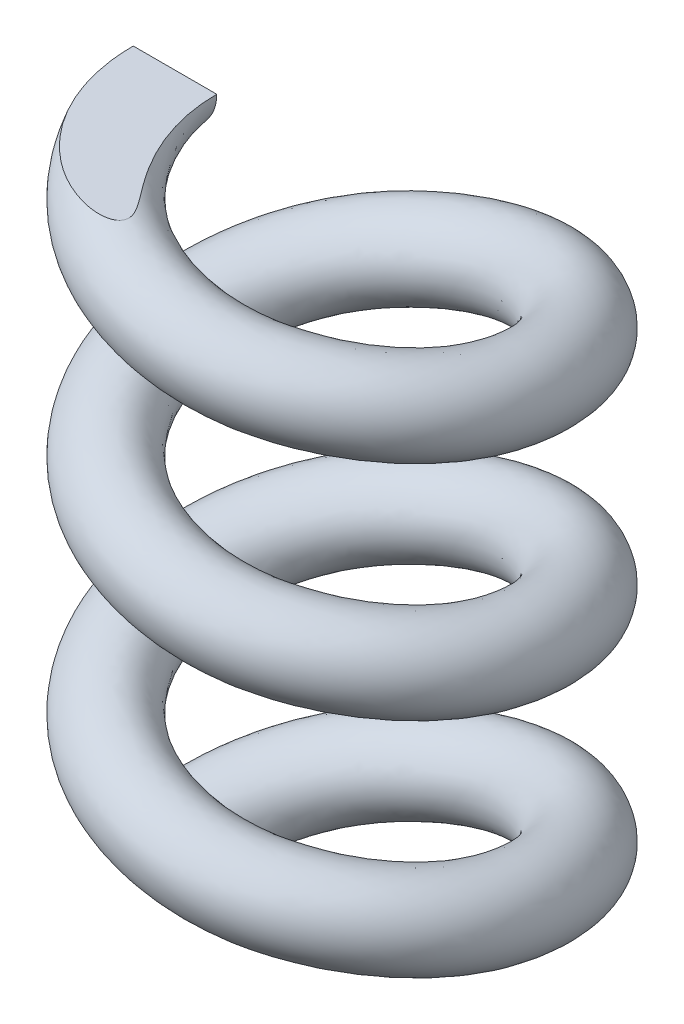
ISO-10303-21;
HEADER;
FILE_DESCRIPTION(('STEP AP214'),'2;1');
FILE_NAME('part.step','',(''),(''),'','','');
FILE_SCHEMA(('AUTOMOTIVE_DESIGN { 1 0 10303 214 1 1 1 1 }'));
ENDSEC;
DATA;
#1=APPLICATION_CONTEXT('core data for automotive mechanical design processes');
#2=APPLICATION_PROTOCOL_DEFINITION('international standard','automotive_design',2000,#1);
#3=PRODUCT_CONTEXT('',#1,'mechanical');
#4=PRODUCT('Part','Part','',(#3));
#5=PRODUCT_RELATED_PRODUCT_CATEGORY('part','',(#4));
#6=PRODUCT_DEFINITION_FORMATION('','',#4);
#7=PRODUCT_DEFINITION_CONTEXT('part definition',#1,'design');
#8=PRODUCT_DEFINITION('design','',#6,#7);
#9=PRODUCT_DEFINITION_SHAPE('','',#8);
#10=(LENGTH_UNIT() NAMED_UNIT(*) SI_UNIT(.MILLI.,.METRE.));
#11=(NAMED_UNIT(*) PLANE_ANGLE_UNIT() SI_UNIT($,.RADIAN.));
#12=(NAMED_UNIT(*) SI_UNIT($,.STERADIAN.) SOLID_ANGLE_UNIT());
#13=UNCERTAINTY_MEASURE_WITH_UNIT(LENGTH_MEASURE(1.E-05),#10,'distance_accuracy_value','');
#14=(GEOMETRIC_REPRESENTATION_CONTEXT(3) GLOBAL_UNCERTAINTY_ASSIGNED_CONTEXT((#13)) GLOBAL_UNIT_ASSIGNED_CONTEXT((#10,
#11,#12)) REPRESENTATION_CONTEXT('',''));
#15=CARTESIAN_POINT('',(0.,0.,0.));
#16=DIRECTION('',(0.,0.,1.));
#17=DIRECTION('',(1.,0.,0.));
#18=AXIS2_PLACEMENT_3D('',#15,#16,#17);
#19=CARTESIAN_POINT('',(-1.,-42.3968629827161,0.));
#20=DIRECTION('',(0.,0.,1.));
#21=DIRECTION('',(1.,0.,0.));
#22=AXIS2_PLACEMENT_3D('',#19,#20,#21);
#23=PLANE('',#22);
#24=DIRECTION('',(-1.,0.,0.));
#25=VECTOR('',#24,1.);
#26=CARTESIAN_POINT('',(-1.,-42.3968629827161,0.));
#27=LINE('',#26,#25);
#28=CARTESIAN_POINT('',(-0.75,-42.3968629827161,0.));
#29=VERTEX_POINT('',#28);
#30=CARTESIAN_POINT('',(-1.25,-42.3968629827161,0.));
#31=VERTEX_POINT('',#30);
#32=EDGE_CURVE('E53',#29,#31,#27,.T.);
#33=ORIENTED_EDGE('',*,*,#32,.F.);
#34=CARTESIAN_POINT('',(-1.,-42.3968629827161,0.));
#35=DIRECTION('',(0.,0.,1.));
#36=DIRECTION('',(1.,0.,0.));
#37=AXIS2_PLACEMENT_3D('',#34,#35,#36);
#38=CIRCLE('',#37,0.25);
#39=EDGE_CURVE('E59',#31,#29,#38,.T.);
#40=ORIENTED_EDGE('',*,*,#39,.F.);
#41=EDGE_LOOP('',(#33,#40));
#42=FACE_BOUND('',#41,.T.);
#43=ADVANCED_FACE('F34',(#42),#23,.F.);
#44=CARTESIAN_POINT('',(-0.75,-42.3968629827161,0.));
#45=CARTESIAN_POINT('',(-0.750000000000018,-42.5079740938272,0.433012701892188));
#46=CARTESIAN_POINT('',(-0.375000000000027,-42.6190852049383,0.649519052838313));
#47=CARTESIAN_POINT('',(0.,-42.7301963160495,0.866025403784438));
#48=CARTESIAN_POINT('',(0.374999999999973,-42.8413074271606,0.649519052838345));
#49=CARTESIAN_POINT('',(0.749999999999981,-42.9524185382717,0.433012701892251));
#50=CARTESIAN_POINT('',(0.75,-43.0635296493828,0.));
#51=CARTESIAN_POINT('',(0.750000000000018,-43.1746407604939,-0.433012701892188));
#52=CARTESIAN_POINT('',(0.375000000000027,-43.285751871605,-0.649519052838313));
#53=CARTESIAN_POINT('',(0.,-43.3968629827161,-0.866025403784438));
#54=CARTESIAN_POINT('',(-0.374999999999972,-43.5079740938272,-0.649519052838345));
#55=CARTESIAN_POINT('',(-0.749999999999981,-43.6190852049383,-0.433012701892251));
#56=CARTESIAN_POINT('',(-0.75,-43.7301963160495,0.));
#57=CARTESIAN_POINT('',(-0.750000000000018,-43.8413074271606,0.433012701892188));
#58=CARTESIAN_POINT('',(-0.375000000000027,-43.9524185382717,0.649519052838313));
#59=CARTESIAN_POINT('',(0.,-44.0635296493828,0.866025403784438));
#60=CARTESIAN_POINT('',(0.374999999999973,-44.1746407604939,0.649519052838345));
#61=CARTESIAN_POINT('',(0.749999999999981,-44.285751871605,0.433012701892251));
#62=CARTESIAN_POINT('',(0.75,-44.3968629827161,0.));
#63=CARTESIAN_POINT('',(0.750000000000018,-44.5079740938272,-0.433012701892188));
#64=CARTESIAN_POINT('',(0.375000000000027,-44.6190852049383,-0.649519052838313));
#65=CARTESIAN_POINT('',(0.,-44.7301963160495,-0.866025403784438));
#66=CARTESIAN_POINT('',(-0.374999999999972,-44.8413074271606,-0.649519052838345));
#67=CARTESIAN_POINT('',(-0.749999999999981,-44.9524185382717,-0.433012701892251));
#68=CARTESIAN_POINT('',(-0.75,-45.0635296493828,0.));
#69=CARTESIAN_POINT('',(-0.750000000000018,-45.1746407604939,0.433012701892188));
#70=CARTESIAN_POINT('',(-0.375000000000027,-45.285751871605,0.649519052838313));
#71=CARTESIAN_POINT('',(0.,-45.3968629827161,0.866025403784438));
#72=CARTESIAN_POINT('',(0.374999999999973,-45.5079740938272,0.649519052838345));
#73=CARTESIAN_POINT('',(0.749999999999981,-45.6190852049383,0.433012701892251));
#74=CARTESIAN_POINT('',(0.75,-45.7301963160494,0.));
#75=CARTESIAN_POINT('',(0.750000000000018,-45.8413074271606,-0.433012701892188));
#76=CARTESIAN_POINT('',(0.375000000000027,-45.9524185382717,-0.649519052838313));
#77=CARTESIAN_POINT('',(0.,-46.0635296493828,-0.866025403784438));
#78=CARTESIAN_POINT('',(-0.374999999999972,-46.1746407604939,-0.649519052838345));
#79=CARTESIAN_POINT('',(-0.749999999999981,-46.285751871605,-0.433012701892251));
#80=CARTESIAN_POINT('',(-0.75,-46.3968629827161,0.));
#81=CARTESIAN_POINT('',(-0.75,-41.8968629827161,0.));
#82=CARTESIAN_POINT('',(-0.750000000000018,-42.0079740938272,0.433012701892188));
#83=CARTESIAN_POINT('',(-0.375000000000027,-42.1190852049383,0.649519052838313));
#84=CARTESIAN_POINT('',(0.,-42.2301963160495,0.866025403784439));
#85=CARTESIAN_POINT('',(0.374999999999973,-42.3413074271606,0.649519052838345));
#86=CARTESIAN_POINT('',(0.749999999999982,-42.4524185382717,0.433012701892251));
#87=CARTESIAN_POINT('',(0.75,-42.5635296493828,0.));
#88=CARTESIAN_POINT('',(0.750000000000018,-42.6746407604939,-0.433012701892188));
#89=CARTESIAN_POINT('',(0.375000000000028,-42.785751871605,-0.649519052838313));
#90=CARTESIAN_POINT('',(0.,-42.8968629827161,-0.866025403784439));
#91=CARTESIAN_POINT('',(-0.374999999999972,-43.0079740938272,-0.649519052838345));
#92=CARTESIAN_POINT('',(-0.749999999999982,-43.1190852049383,-0.433012701892251));
#93=CARTESIAN_POINT('',(-0.75,-43.2301963160495,0.));
#94=CARTESIAN_POINT('',(-0.750000000000018,-43.3413074271606,0.433012701892188));
#95=CARTESIAN_POINT('',(-0.375000000000027,-43.4524185382717,0.649519052838313));
#96=CARTESIAN_POINT('',(0.,-43.5635296493828,0.866025403784439));
#97=CARTESIAN_POINT('',(0.374999999999973,-43.6746407604939,0.649519052838345));
#98=CARTESIAN_POINT('',(0.749999999999982,-43.785751871605,0.433012701892251));
#99=CARTESIAN_POINT('',(0.75,-43.8968629827161,0.));
#100=CARTESIAN_POINT('',(0.750000000000018,-44.0079740938272,-0.433012701892188));
#101=CARTESIAN_POINT('',(0.375000000000028,-44.1190852049383,-0.649519052838313));
#102=CARTESIAN_POINT('',(0.,-44.2301963160495,-0.866025403784439));
#103=CARTESIAN_POINT('',(-0.374999999999972,-44.3413074271606,-0.649519052838345));
#104=CARTESIAN_POINT('',(-0.749999999999982,-44.4524185382717,-0.433012701892251));
#105=CARTESIAN_POINT('',(-0.75,-44.5635296493828,0.));
#106=CARTESIAN_POINT('',(-0.750000000000018,-44.6746407604939,0.433012701892188));
#107=CARTESIAN_POINT('',(-0.375000000000027,-44.785751871605,0.649519052838313));
#108=CARTESIAN_POINT('',(0.,-44.8968629827161,0.866025403784439));
#109=CARTESIAN_POINT('',(0.374999999999973,-45.0079740938272,0.649519052838345));
#110=CARTESIAN_POINT('',(0.749999999999982,-45.1190852049383,0.433012701892251));
#111=CARTESIAN_POINT('',(0.75,-45.2301963160494,0.));
#112=CARTESIAN_POINT('',(0.750000000000018,-45.3413074271606,-0.433012701892188));
#113=CARTESIAN_POINT('',(0.375000000000028,-45.4524185382717,-0.649519052838313));
#114=CARTESIAN_POINT('',(0.,-45.5635296493828,-0.866025403784439));
#115=CARTESIAN_POINT('',(-0.374999999999972,-45.6746407604939,-0.649519052838345));
#116=CARTESIAN_POINT('',(-0.749999999999982,-45.785751871605,-0.433012701892251));
#117=CARTESIAN_POINT('',(-0.75,-45.8968629827161,0.));
#118=CARTESIAN_POINT('',(-1.25,-41.8968629827161,0.));
#119=CARTESIAN_POINT('',(-1.25000000000003,-42.0079740938272,0.72168783648698));
#120=CARTESIAN_POINT('',(-0.625000000000045,-42.1190852049383,1.08253175473052));
#121=CARTESIAN_POINT('',(0.,-42.2301963160495,1.44337567297406));
#122=CARTESIAN_POINT('',(0.624999999999954,-42.3413074271606,1.08253175473057));
#123=CARTESIAN_POINT('',(1.24999999999997,-42.4524185382717,0.721687836487085));
#124=CARTESIAN_POINT('',(1.25,-42.5635296493828,0.));
#125=CARTESIAN_POINT('',(1.25000000000003,-42.6746407604939,-0.721687836486979));
#126=CARTESIAN_POINT('',(0.625000000000046,-42.785751871605,-1.08253175473052));
#127=CARTESIAN_POINT('',(0.,-42.8968629827161,-1.44337567297406));
#128=CARTESIAN_POINT('',(-0.624999999999954,-43.0079740938272,-1.08253175473058));
#129=CARTESIAN_POINT('',(-1.24999999999997,-43.1190852049383,-0.721687836487085));
#130=CARTESIAN_POINT('',(-1.25,-43.2301963160495,0.));
#131=CARTESIAN_POINT('',(-1.25000000000003,-43.3413074271606,0.72168783648698));
#132=CARTESIAN_POINT('',(-0.625000000000045,-43.4524185382717,1.08253175473052));
#133=CARTESIAN_POINT('',(0.,-43.5635296493828,1.44337567297406));
#134=CARTESIAN_POINT('',(0.624999999999954,-43.6746407604939,1.08253175473057));
#135=CARTESIAN_POINT('',(1.24999999999997,-43.785751871605,0.721687836487085));
#136=CARTESIAN_POINT('',(1.25,-43.8968629827161,0.));
#137=CARTESIAN_POINT('',(1.25000000000003,-44.0079740938272,-0.721687836486979));
#138=CARTESIAN_POINT('',(0.625000000000046,-44.1190852049383,-1.08253175473052));
#139=CARTESIAN_POINT('',(0.,-44.2301963160495,-1.44337567297406));
#140=CARTESIAN_POINT('',(-0.624999999999954,-44.3413074271606,-1.08253175473058));
#141=CARTESIAN_POINT('',(-1.24999999999997,-44.4524185382717,-0.721687836487085));
#142=CARTESIAN_POINT('',(-1.25,-44.5635296493828,0.));
#143=CARTESIAN_POINT('',(-1.25000000000003,-44.6746407604939,0.72168783648698));
#144=CARTESIAN_POINT('',(-0.625000000000045,-44.785751871605,1.08253175473052));
#145=CARTESIAN_POINT('',(0.,-44.8968629827161,1.44337567297406));
#146=CARTESIAN_POINT('',(0.624999999999954,-45.0079740938272,1.08253175473057));
#147=CARTESIAN_POINT('',(1.24999999999997,-45.1190852049383,0.721687836487085));
#148=CARTESIAN_POINT('',(1.25,-45.2301963160494,0.));
#149=CARTESIAN_POINT('',(1.25000000000003,-45.3413074271606,-0.721687836486979));
#150=CARTESIAN_POINT('',(0.625000000000046,-45.4524185382717,-1.08253175473052));
#151=CARTESIAN_POINT('',(0.,-45.5635296493828,-1.44337567297406));
#152=CARTESIAN_POINT('',(-0.624999999999954,-45.6746407604939,-1.08253175473058));
#153=CARTESIAN_POINT('',(-1.24999999999997,-45.785751871605,-0.721687836487085));
#154=CARTESIAN_POINT('',(-1.25,-45.8968629827161,0.));
#155=CARTESIAN_POINT('',(-1.25,-42.3968629827161,0.));
#156=CARTESIAN_POINT('',(-1.25000000000003,-42.5079740938272,0.72168783648698));
#157=CARTESIAN_POINT('',(-0.625000000000045,-42.6190852049383,1.08253175473052));
#158=CARTESIAN_POINT('',(0.,-42.7301963160495,1.44337567297406));
#159=CARTESIAN_POINT('',(0.624999999999954,-42.8413074271606,1.08253175473057));
#160=CARTESIAN_POINT('',(1.24999999999997,-42.9524185382717,0.721687836487085));
#161=CARTESIAN_POINT('',(1.25,-43.0635296493828,0.));
#162=CARTESIAN_POINT('',(1.25000000000003,-43.1746407604939,-0.721687836486979));
#163=CARTESIAN_POINT('',(0.625000000000046,-43.285751871605,-1.08253175473052));
#164=CARTESIAN_POINT('',(0.,-43.3968629827161,-1.44337567297406));
#165=CARTESIAN_POINT('',(-0.624999999999954,-43.5079740938272,-1.08253175473058));
#166=CARTESIAN_POINT('',(-1.24999999999997,-43.6190852049383,-0.721687836487085));
#167=CARTESIAN_POINT('',(-1.25,-43.7301963160495,0.));
#168=CARTESIAN_POINT('',(-1.25000000000003,-43.8413074271606,0.72168783648698));
#169=CARTESIAN_POINT('',(-0.625000000000045,-43.9524185382717,1.08253175473052));
#170=CARTESIAN_POINT('',(0.,-44.0635296493828,1.44337567297406));
#171=CARTESIAN_POINT('',(0.624999999999954,-44.1746407604939,1.08253175473057));
#172=CARTESIAN_POINT('',(1.24999999999997,-44.285751871605,0.721687836487085));
#173=CARTESIAN_POINT('',(1.25,-44.3968629827161,0.));
#174=CARTESIAN_POINT('',(1.25000000000003,-44.5079740938272,-0.721687836486979));
#175=CARTESIAN_POINT('',(0.625000000000046,-44.6190852049383,-1.08253175473052));
#176=CARTESIAN_POINT('',(0.,-44.7301963160495,-1.44337567297406));
#177=CARTESIAN_POINT('',(-0.624999999999954,-44.8413074271606,-1.08253175473058));
#178=CARTESIAN_POINT('',(-1.24999999999997,-44.9524185382717,-0.721687836487085));
#179=CARTESIAN_POINT('',(-1.25,-45.0635296493828,0.));
#180=CARTESIAN_POINT('',(-1.25000000000003,-45.1746407604939,0.72168783648698));
#181=CARTESIAN_POINT('',(-0.625000000000045,-45.285751871605,1.08253175473052));
#182=CARTESIAN_POINT('',(0.,-45.3968629827161,1.44337567297406));
#183=CARTESIAN_POINT('',(0.624999999999954,-45.5079740938272,1.08253175473057));
#184=CARTESIAN_POINT('',(1.24999999999997,-45.6190852049383,0.721687836487085));
#185=CARTESIAN_POINT('',(1.25,-45.7301963160494,0.));
#186=CARTESIAN_POINT('',(1.25000000000003,-45.8413074271606,-0.721687836486979));
#187=CARTESIAN_POINT('',(0.625000000000046,-45.9524185382717,-1.08253175473052));
#188=CARTESIAN_POINT('',(0.,-46.0635296493828,-1.44337567297406));
#189=CARTESIAN_POINT('',(-0.624999999999954,-46.1746407604939,-1.08253175473058));
#190=CARTESIAN_POINT('',(-1.24999999999997,-46.285751871605,-0.721687836487085));
#191=CARTESIAN_POINT('',(-1.25,-46.3968629827161,0.));
#192=CARTESIAN_POINT('',(-1.25,-42.8968629827161,0.));
#193=CARTESIAN_POINT('',(-1.25000000000003,-43.0079740938272,0.72168783648698));
#194=CARTESIAN_POINT('',(-0.625000000000045,-43.1190852049383,1.08253175473052));
#195=CARTESIAN_POINT('',(0.,-43.2301963160495,1.44337567297406));
#196=CARTESIAN_POINT('',(0.624999999999954,-43.3413074271606,1.08253175473057));
#197=CARTESIAN_POINT('',(1.24999999999997,-43.4524185382717,0.721687836487085));
#198=CARTESIAN_POINT('',(1.25,-43.5635296493828,0.));
#199=CARTESIAN_POINT('',(1.25000000000003,-43.6746407604939,-0.721687836486979));
#200=CARTESIAN_POINT('',(0.625000000000046,-43.785751871605,-1.08253175473052));
#201=CARTESIAN_POINT('',(0.,-43.8968629827161,-1.44337567297406));
#202=CARTESIAN_POINT('',(-0.624999999999954,-44.0079740938272,-1.08253175473057));
#203=CARTESIAN_POINT('',(-1.24999999999997,-44.1190852049383,-0.721687836487085));
#204=CARTESIAN_POINT('',(-1.25,-44.2301963160495,0.));
#205=CARTESIAN_POINT('',(-1.25000000000003,-44.3413074271606,0.72168783648698));
#206=CARTESIAN_POINT('',(-0.625000000000045,-44.4524185382717,1.08253175473052));
#207=CARTESIAN_POINT('',(0.,-44.5635296493828,1.44337567297406));
#208=CARTESIAN_POINT('',(0.624999999999954,-44.6746407604939,1.08253175473057));
#209=CARTESIAN_POINT('',(1.24999999999997,-44.785751871605,0.721687836487085));
#210=CARTESIAN_POINT('',(1.25,-44.8968629827161,0.));
#211=CARTESIAN_POINT('',(1.25000000000003,-45.0079740938272,-0.721687836486979));
#212=CARTESIAN_POINT('',(0.625000000000046,-45.1190852049383,-1.08253175473052));
#213=CARTESIAN_POINT('',(0.,-45.2301963160495,-1.44337567297406));
#214=CARTESIAN_POINT('',(-0.624999999999954,-45.3413074271606,-1.08253175473057));
#215=CARTESIAN_POINT('',(-1.24999999999997,-45.4524185382717,-0.721687836487085));
#216=CARTESIAN_POINT('',(-1.25,-45.5635296493828,0.));
#217=CARTESIAN_POINT('',(-1.25000000000003,-45.6746407604939,0.72168783648698));
#218=CARTESIAN_POINT('',(-0.625000000000045,-45.785751871605,1.08253175473052));
#219=CARTESIAN_POINT('',(0.,-45.8968629827161,1.44337567297406));
#220=CARTESIAN_POINT('',(0.624999999999954,-46.0079740938272,1.08253175473057));
#221=CARTESIAN_POINT('',(1.24999999999997,-46.1190852049383,0.721687836487085));
#222=CARTESIAN_POINT('',(1.25,-46.2301963160494,0.));
#223=CARTESIAN_POINT('',(1.25000000000003,-46.3413074271606,-0.721687836486979));
#224=CARTESIAN_POINT('',(0.625000000000046,-46.4524185382717,-1.08253175473052));
#225=CARTESIAN_POINT('',(0.,-46.5635296493828,-1.44337567297406));
#226=CARTESIAN_POINT('',(-0.624999999999954,-46.6746407604939,-1.08253175473057));
#227=CARTESIAN_POINT('',(-1.24999999999997,-46.785751871605,-0.721687836487085));
#228=CARTESIAN_POINT('',(-1.25,-46.8968629827161,0.));
#229=CARTESIAN_POINT('',(-0.75,-42.8968629827161,0.));
#230=CARTESIAN_POINT('',(-0.750000000000018,-43.0079740938272,0.433012701892188));
#231=CARTESIAN_POINT('',(-0.375000000000027,-43.1190852049383,0.649519052838313));
#232=CARTESIAN_POINT('',(0.,-43.2301963160495,0.866025403784439));
#233=CARTESIAN_POINT('',(0.374999999999973,-43.3413074271606,0.649519052838345));
#234=CARTESIAN_POINT('',(0.749999999999982,-43.4524185382717,0.433012701892251));
#235=CARTESIAN_POINT('',(0.75,-43.5635296493828,0.));
#236=CARTESIAN_POINT('',(0.750000000000018,-43.6746407604939,-0.433012701892188));
#237=CARTESIAN_POINT('',(0.375000000000028,-43.785751871605,-0.649519052838313));
#238=CARTESIAN_POINT('',(0.,-43.8968629827161,-0.866025403784439));
#239=CARTESIAN_POINT('',(-0.374999999999972,-44.0079740938272,-0.649519052838345));
#240=CARTESIAN_POINT('',(-0.749999999999982,-44.1190852049383,-0.433012701892251));
#241=CARTESIAN_POINT('',(-0.75,-44.2301963160495,0.));
#242=CARTESIAN_POINT('',(-0.750000000000018,-44.3413074271606,0.433012701892188));
#243=CARTESIAN_POINT('',(-0.375000000000027,-44.4524185382717,0.649519052838313));
#244=CARTESIAN_POINT('',(0.,-44.5635296493828,0.866025403784439));
#245=CARTESIAN_POINT('',(0.374999999999973,-44.6746407604939,0.649519052838345));
#246=CARTESIAN_POINT('',(0.749999999999982,-44.785751871605,0.433012701892251));
#247=CARTESIAN_POINT('',(0.75,-44.8968629827161,0.));
#248=CARTESIAN_POINT('',(0.750000000000018,-45.0079740938272,-0.433012701892188));
#249=CARTESIAN_POINT('',(0.375000000000028,-45.1190852049383,-0.649519052838313));
#250=CARTESIAN_POINT('',(0.,-45.2301963160495,-0.866025403784439));
#251=CARTESIAN_POINT('',(-0.374999999999972,-45.3413074271606,-0.649519052838345));
#252=CARTESIAN_POINT('',(-0.749999999999982,-45.4524185382717,-0.433012701892251));
#253=CARTESIAN_POINT('',(-0.75,-45.5635296493828,0.));
#254=CARTESIAN_POINT('',(-0.750000000000018,-45.6746407604939,0.433012701892188));
#255=CARTESIAN_POINT('',(-0.375000000000027,-45.785751871605,0.649519052838313));
#256=CARTESIAN_POINT('',(0.,-45.8968629827161,0.866025403784439));
#257=CARTESIAN_POINT('',(0.374999999999973,-46.0079740938272,0.649519052838345));
#258=CARTESIAN_POINT('',(0.749999999999982,-46.1190852049383,0.433012701892251));
#259=CARTESIAN_POINT('',(0.75,-46.2301963160494,0.));
#260=CARTESIAN_POINT('',(0.750000000000018,-46.3413074271606,-0.433012701892188));
#261=CARTESIAN_POINT('',(0.375000000000028,-46.4524185382717,-0.649519052838313));
#262=CARTESIAN_POINT('',(0.,-46.5635296493828,-0.866025403784439));
#263=CARTESIAN_POINT('',(-0.374999999999972,-46.6746407604939,-0.649519052838345));
#264=CARTESIAN_POINT('',(-0.749999999999982,-46.785751871605,-0.433012701892251));
#265=CARTESIAN_POINT('',(-0.75,-46.8968629827161,0.));
#266=CARTESIAN_POINT('',(-0.75,-42.3968629827161,0.));
#267=CARTESIAN_POINT('',(-0.750000000000018,-42.5079740938272,0.433012701892188));
#268=CARTESIAN_POINT('',(-0.375000000000027,-42.6190852049383,0.649519052838313));
#269=CARTESIAN_POINT('',(0.,-42.7301963160495,0.866025403784438));
#270=CARTESIAN_POINT('',(0.374999999999973,-42.8413074271606,0.649519052838345));
#271=CARTESIAN_POINT('',(0.749999999999981,-42.9524185382717,0.433012701892251));
#272=CARTESIAN_POINT('',(0.75,-43.0635296493828,0.));
#273=CARTESIAN_POINT('',(0.750000000000018,-43.1746407604939,-0.433012701892188));
#274=CARTESIAN_POINT('',(0.375000000000027,-43.285751871605,-0.649519052838313));
#275=CARTESIAN_POINT('',(0.,-43.3968629827161,-0.866025403784438));
#276=CARTESIAN_POINT('',(-0.374999999999972,-43.5079740938272,-0.649519052838345));
#277=CARTESIAN_POINT('',(-0.749999999999981,-43.6190852049383,-0.433012701892251));
#278=CARTESIAN_POINT('',(-0.75,-43.7301963160495,0.));
#279=CARTESIAN_POINT('',(-0.750000000000018,-43.8413074271606,0.433012701892188));
#280=CARTESIAN_POINT('',(-0.375000000000027,-43.9524185382717,0.649519052838313));
#281=CARTESIAN_POINT('',(0.,-44.0635296493828,0.866025403784438));
#282=CARTESIAN_POINT('',(0.374999999999973,-44.1746407604939,0.649519052838345));
#283=CARTESIAN_POINT('',(0.749999999999981,-44.285751871605,0.433012701892251));
#284=CARTESIAN_POINT('',(0.75,-44.3968629827161,0.));
#285=CARTESIAN_POINT('',(0.750000000000018,-44.5079740938272,-0.433012701892188));
#286=CARTESIAN_POINT('',(0.375000000000027,-44.6190852049383,-0.649519052838313));
#287=CARTESIAN_POINT('',(0.,-44.7301963160495,-0.866025403784438));
#288=CARTESIAN_POINT('',(-0.374999999999972,-44.8413074271606,-0.649519052838345));
#289=CARTESIAN_POINT('',(-0.749999999999981,-44.9524185382717,-0.433012701892251));
#290=CARTESIAN_POINT('',(-0.75,-45.0635296493828,0.));
#291=CARTESIAN_POINT('',(-0.750000000000018,-45.1746407604939,0.433012701892188));
#292=CARTESIAN_POINT('',(-0.375000000000027,-45.285751871605,0.649519052838313));
#293=CARTESIAN_POINT('',(0.,-45.3968629827161,0.866025403784438));
#294=CARTESIAN_POINT('',(0.374999999999973,-45.5079740938272,0.649519052838345));
#295=CARTESIAN_POINT('',(0.749999999999981,-45.6190852049383,0.433012701892251));
#296=CARTESIAN_POINT('',(0.75,-45.7301963160494,0.));
#297=CARTESIAN_POINT('',(0.750000000000018,-45.8413074271606,-0.433012701892188));
#298=CARTESIAN_POINT('',(0.375000000000027,-45.9524185382717,-0.649519052838313));
#299=CARTESIAN_POINT('',(0.,-46.0635296493828,-0.866025403784438));
#300=CARTESIAN_POINT('',(-0.374999999999972,-46.1746407604939,-0.649519052838345));
#301=CARTESIAN_POINT('',(-0.749999999999981,-46.285751871605,-0.433012701892251));
#302=CARTESIAN_POINT('',(-0.75,-46.3968629827161,0.));
#303=(BOUNDED_SURFACE() B_SPLINE_SURFACE(3,2,((#44,#45,#46,#47,#48,#49,#50,#51,#52,#53,#54,#55,
#56,#57,#58,#59,#60,#61,#62,#63,#64,#65,#66,#67,#68,#69,#70,#71,#72,#73,#74,#75,#76,#77,#78,#79,
#80),(#81,#82,#83,#84,#85,#86,#87,#88,#89,#90,#91,#92,#93,#94,#95,#96,#97,#98,#99,#100,#101,
#102,#103,#104,#105,#106,#107,#108,#109,#110,#111,#112,#113,#114,#115,#116,#117),(#118,#119,
#120,#121,#122,#123,#124,#125,#126,#127,#128,#129,#130,#131,#132,#133,#134,#135,#136,#137,#138,
#139,#140,#141,#142,#143,#144,#145,#146,#147,#148,#149,#150,#151,#152,#153,#154),(#155,#156,
#157,#158,#159,#160,#161,#162,#163,#164,#165,#166,#167,#168,#169,#170,#171,#172,#173,#174,#175,
#176,#177,#178,#179,#180,#181,#182,#183,#184,#185,#186,#187,#188,#189,#190,#191),(#192,#193,
#194,#195,#196,#197,#198,#199,#200,#201,#202,#203,#204,#205,#206,#207,#208,#209,#210,#211,#212,
#213,#214,#215,#216,#217,#218,#219,#220,#221,#222,#223,#224,#225,#226,#227,#228),(#229,#230,
#231,#232,#233,#234,#235,#236,#237,#238,#239,#240,#241,#242,#243,#244,#245,#246,#247,#248,#249,
#250,#251,#252,#253,#254,#255,#256,#257,#258,#259,#260,#261,#262,#263,#264,#265),(#266,#267,
#268,#269,#270,#271,#272,#273,#274,#275,#276,#277,#278,#279,#280,#281,#282,#283,#284,#285,#286,
#287,#288,#289,#290,#291,#292,#293,#294,#295,#296,#297,#298,#299,#300,#301,#302)),.UNSPECIFIED.,
.T.,.F.,.F.) B_SPLINE_SURFACE_WITH_KNOTS((4,3,4),(3,2,2,2,2,2,2,2,2,2,2,2,2,2,2,2,2,2,3),(0.,
0.5,1.),(0.,0.0555555555555556,0.111111111111111,0.166666666666667,0.222222222222222,
0.277777777777778,0.333333333333333,0.388888888888889,0.444444444444444,0.5,0.555555555555556,
0.611111111111111,0.666666666666667,0.722222222222222,0.777777777777778,0.833333333333333,
0.888888888888889,0.944444444444444,1.),
.UNSPECIFIED.) GEOMETRIC_REPRESENTATION_ITEM() RATIONAL_B_SPLINE_SURFACE(((1.,0.866025403784439,
1.,0.866025403784439,1.,0.866025403784439,1.,0.866025403784439,1.,0.866025403784439,1.,
0.866025403784439,1.,0.866025403784439,1.,0.866025403784439,1.,0.866025403784439,1.,
0.866025403784439,1.,0.866025403784439,1.,0.866025403784439,1.,0.866025403784439,1.,
0.866025403784439,1.,0.866025403784439,1.,0.866025403784439,1.,0.866025403784439,1.,
0.866025403784439,1.),(0.333333333333333,0.288675134594813,0.333333333333333,0.288675134594813,
0.333333333333333,0.288675134594813,0.333333333333333,0.288675134594813,0.333333333333333,
0.288675134594813,0.333333333333333,0.288675134594813,0.333333333333333,0.288675134594813,
0.333333333333333,0.288675134594813,0.333333333333333,0.288675134594813,0.333333333333333,
0.288675134594813,0.333333333333333,0.288675134594813,0.333333333333333,0.288675134594813,
0.333333333333333,0.288675134594813,0.333333333333333,0.288675134594813,0.333333333333333,
0.288675134594813,0.333333333333333,0.288675134594813,0.333333333333333,0.288675134594813,
0.333333333333333,0.288675134594813,0.333333333333333),(0.333333333333333,0.288675134594813,
0.333333333333333,0.288675134594813,0.333333333333333,0.288675134594813,0.333333333333333,
0.288675134594813,0.333333333333333,0.288675134594813,0.333333333333333,0.288675134594813,
0.333333333333333,0.288675134594813,0.333333333333333,0.288675134594813,0.333333333333333,
0.288675134594813,0.333333333333333,0.288675134594813,0.333333333333333,0.288675134594813,
0.333333333333333,0.288675134594813,0.333333333333333,0.288675134594813,0.333333333333333,
0.288675134594813,0.333333333333333,0.288675134594813,0.333333333333333,0.288675134594813,
0.333333333333333,0.288675134594813,0.333333333333333,0.288675134594813,0.333333333333333),(1.,
0.866025403784439,1.,0.866025403784439,1.,0.866025403784439,1.,0.866025403784439,1.,
0.866025403784439,1.,0.866025403784439,1.,0.866025403784439,1.,0.866025403784439,1.,
0.866025403784439,1.,0.866025403784439,1.,0.866025403784439,1.,0.866025403784439,1.,
0.866025403784439,1.,0.866025403784439,1.,0.866025403784439,1.,0.866025403784439,1.,
0.866025403784439,1.,0.866025403784439,1.),(0.333333333333333,0.288675134594813,
0.333333333333333,0.288675134594813,0.333333333333333,0.288675134594813,0.333333333333333,
0.288675134594813,0.333333333333333,0.288675134594813,0.333333333333333,0.288675134594813,
0.333333333333333,0.288675134594813,0.333333333333333,0.288675134594813,0.333333333333333,
0.288675134594813,0.333333333333333,0.288675134594813,0.333333333333333,0.288675134594813,
0.333333333333333,0.288675134594813,0.333333333333333,0.288675134594813,0.333333333333333,
0.288675134594813,0.333333333333333,0.288675134594813,0.333333333333333,0.288675134594813,
0.333333333333333,0.288675134594813,0.333333333333333,0.288675134594813,0.333333333333333),
(0.333333333333333,0.288675134594813,0.333333333333333,0.288675134594813,0.333333333333333,
0.288675134594813,0.333333333333333,0.288675134594813,0.333333333333333,0.288675134594813,
0.333333333333333,0.288675134594813,0.333333333333333,0.288675134594813,0.333333333333333,
0.288675134594813,0.333333333333333,0.288675134594813,0.333333333333333,0.288675134594813,
0.333333333333333,0.288675134594813,0.333333333333333,0.288675134594813,0.333333333333333,
0.288675134594813,0.333333333333333,0.288675134594813,0.333333333333333,0.288675134594813,
0.333333333333333,0.288675134594813,0.333333333333333,0.288675134594813,0.333333333333333,
0.288675134594813,0.333333333333333),(1.,0.866025403784439,1.,0.866025403784439,1.,
0.866025403784439,1.,0.866025403784439,1.,0.866025403784439,1.,0.866025403784439,1.,
0.866025403784439,1.,0.866025403784439,1.,0.866025403784439,1.,0.866025403784439,1.,
0.866025403784439,1.,0.866025403784439,1.,0.866025403784439,1.,0.866025403784439,1.,
0.866025403784439,1.,0.866025403784439,1.,0.866025403784439,1.,0.866025403784439,1.))) REPRESENTATION_ITEM('') SURFACE());
#304=CARTESIAN_POINT('',(-1.,-46.3968629827161,0.));
#305=DIRECTION('',(0.,0.,1.));
#306=DIRECTION('',(1.,0.,0.));
#307=AXIS2_PLACEMENT_3D('',#304,#305,#306);
#308=CIRCLE('',#307,0.25);
#309=CARTESIAN_POINT('',(-0.75,-46.3968629827161,0.));
#310=VERTEX_POINT('',#309);
#311=EDGE_CURVE('E47',#310,#310,#308,.T.);
#312=CARTESIAN_POINT('',(-0.75,-42.3968629827161,0.));
#313=CARTESIAN_POINT('',(-0.750019197805944,-42.3968629827161,0.0563931550216914));
#314=CARTESIAN_POINT('',(-0.74490830442211,-42.3968629827161,0.112645285859672));
#315=CARTESIAN_POINT('',(-0.725650425367437,-42.3968629827161,0.22308604493589));
#316=CARTESIAN_POINT('',(-0.711584766502311,-42.3968629827161,0.277288640722587));
#317=CARTESIAN_POINT('',(-0.681924617975304,-42.3968629827161,0.364343024082463));
#318=CARTESIAN_POINT('',(-0.668605236009182,-42.3968629827161,0.398002944355629));
#319=CARTESIAN_POINT('',(-0.638981726093069,-42.3968629827161,0.463982435725182));
#320=CARTESIAN_POINT('',(-0.622677807383021,-42.3968629827161,0.496302100589505));
#321=CARTESIAN_POINT('',(-0.587430796648301,-42.3968629827161,0.55956889584223));
#322=CARTESIAN_POINT('',(-0.568480746955,-42.3968629827161,0.590512114623924));
#323=CARTESIAN_POINT('',(-0.528484398422739,-42.3968629827161,0.650987213276562));
#324=CARTESIAN_POINT('',(-0.507438324041111,-42.3968629827161,0.680519243767517));
#325=CARTESIAN_POINT('',(-0.478344658734664,-42.3968629827161,0.719768384888435));
#326=CARTESIAN_POINT('',(-0.470770740523887,-42.3968629827161,0.729848162540344));
#327=CARTESIAN_POINT('',(-0.45553734853873,-42.3968629827161,0.749950160125026));
#328=CARTESIAN_POINT('',(-0.447877839816545,-42.3968629827161,0.75997235381294));
#329=CARTESIAN_POINT('',(-0.432735347366009,-42.3968629827161,0.780133674136744));
#330=CARTESIAN_POINT('',(-0.42525218541823,-42.396862982716,0.790272665813446));
#331=CARTESIAN_POINT('',(-0.410790939246471,-42.3968629827162,0.810900712478454));
#332=CARTESIAN_POINT('',(-0.403812316686003,-42.3968629827164,0.821389376369351));
#333=CARTESIAN_POINT('',(-0.393047136728821,-42.3968629827163,0.839390015587154));
#334=CARTESIAN_POINT('',(-0.388973054400681,-42.3968629827162,0.846725809065013));
#335=CARTESIAN_POINT('',(-0.381639975211485,-42.3968629827161,0.861780524973138));
#336=CARTESIAN_POINT('',(-0.378378475518451,-42.3968629827161,0.869498180944337));
#337=CARTESIAN_POINT('',(-0.37338287283214,-42.3968629827161,0.88520008613966));
#338=CARTESIAN_POINT('',(-0.371602887109263,-42.3968629827161,0.893167701396326));
#339=CARTESIAN_POINT('',(-0.370760359319993,-42.3968629827161,0.907985489521806));
#340=CARTESIAN_POINT('',(-0.371281596980564,-42.3968629827161,0.914791003323552));
#341=CARTESIAN_POINT('',(-0.37394596083312,-42.3968629827161,0.924525465919743));
#342=CARTESIAN_POINT('',(-0.375160768845759,-42.3968629827161,0.927708774710685));
#343=CARTESIAN_POINT('',(-0.378194837532726,-42.3968629827161,0.933773093813547));
#344=CARTESIAN_POINT('',(-0.380014245582774,-42.3968629827161,0.936654030194442));
#345=CARTESIAN_POINT('',(-0.385655231302868,-42.3968629827161,0.943958166447944));
#346=CARTESIAN_POINT('',(-0.389974578040695,-42.3968629827161,0.947995741697526));
#347=CARTESIAN_POINT('',(-0.402695921411647,-42.3968629827161,0.95732653300991));
#348=CARTESIAN_POINT('',(-0.411843562005317,-42.3968629827161,0.961529867705186));
#349=CARTESIAN_POINT('',(-0.430008943289414,-42.3968629827161,0.967547188758197));
#350=CARTESIAN_POINT('',(-0.438986301224727,-42.3968629827161,0.969514829074155));
#351=CARTESIAN_POINT('',(-0.457141086641515,-42.3968629827161,0.972200112062905));
#352=CARTESIAN_POINT('',(-0.466318924818757,-42.3968629827161,0.972914884974223));
#353=CARTESIAN_POINT('',(-0.494605864565102,-42.3968629827161,0.973698059414548));
#354=CARTESIAN_POINT('',(-0.513746334206318,-42.3968629827161,0.972237024632648));
#355=CARTESIAN_POINT('',(-0.551638690425249,-42.3968629827161,0.96674928043765));
#356=CARTESIAN_POINT('',(-0.570389183921453,-42.3968629827161,0.962714608629184));
#357=CARTESIAN_POINT('',(-0.626749002498261,-42.3968629827161,0.947850194689302));
#358=CARTESIAN_POINT('',(-0.663656724831351,-42.3968629827161,0.93432020373489));
#359=CARTESIAN_POINT('',(-0.734942692642027,-42.3968629827161,0.90183030141064));
#360=CARTESIAN_POINT('',(-0.769318275182145,-42.3968629827161,0.882864773388821));
#361=CARTESIAN_POINT('',(-0.845627803331211,-42.3968629827161,0.833704570223143));
#362=CARTESIAN_POINT('',(-0.886503160987499,-42.3968629827161,0.801856094740219));
#363=CARTESIAN_POINT('',(-0.962436374553396,-42.3968629827161,0.731896403057052));
#364=CARTESIAN_POINT('',(-0.997492234601342,-42.3968629827161,0.693783047128334));
#365=CARTESIAN_POINT('',(-1.06146220535151,-42.3968629827161,0.61223251406535));
#366=CARTESIAN_POINT('',(-1.09032553141701,-42.3968629827161,0.568755603121133));
#367=CARTESIAN_POINT('',(-1.1411147934179,-42.3968629827161,0.477916163796128));
#368=CARTESIAN_POINT('',(-1.16303762677047,-42.3968629827161,0.430551909550442));
#369=CARTESIAN_POINT('',(-1.20150232278839,-42.3968629827161,0.328168624423425));
#370=CARTESIAN_POINT('',(-1.2172738752776,-42.3968629827161,0.272860251897978));
#371=CARTESIAN_POINT('',(-1.23984197238682,-42.3968629827161,0.160521087586459));
#372=CARTESIAN_POINT('',(-1.24665266876493,-42.3968629827162,0.103493157551708));
#373=CARTESIAN_POINT('',(-1.24968070686967,-42.3968629827161,0.0308992514969344));
#374=CARTESIAN_POINT('',(-1.25000162375307,-42.3968629827161,0.0154463766421138));
#375=CARTESIAN_POINT('',(-1.25,-42.3968629827161,0.));
#376=B_SPLINE_CURVE_WITH_KNOTS('',3,(#312,#313,#314,#315,#316,#317,#318,#319,#320,#321,#322,
#323,#324,#325,#326,#327,#328,#329,#330,#331,#332,#333,#334,#335,#336,#337,#338,#339,#340,#341,
#342,#343,#344,#345,#346,#347,#348,#349,#350,#351,#352,#353,#354,#355,#356,#357,#358,#359,#360,
#361,#362,#363,#364,#365,#366,#367,#368,#369,#370,#371,#372,#373,#374,#375),.UNSPECIFIED.,.F.,
.F.,(4,2,2,2,2,2,2,2,2,2,2,2,2,2,2,2,2,2,2,2,2,2,2,2,2,2,2,2,2,2,2,4),(0.,0.168761069749062,
0.33601090729652,0.444474186775494,0.552929865019694,0.661676280365324,0.770411062862321,
0.808236366488214,0.846077724225719,0.883879038781849,0.92163940568141,0.946784789261798,
0.971851737584854,0.996109965634853,1.01617872451005,1.02633441349741,1.03649257982702,
1.05397465866469,1.08365601891977,1.11114331540793,1.13869349118013,1.19596821290949,
1.25342099805507,1.37072222980827,1.4881451110655,1.64279286960519,1.79749355723321,
1.95341815880293,2.10941236467082,2.28121279378832,2.45274157384595,2.49909480461264),.UNSPECIFIED.);
#377=EDGE_CURVE('E12',#29,#31,#376,.T.);
#378=ORIENTED_EDGE('',*,*,#311,.F.);
#379=EDGE_LOOP('',(#378));
#380=FACE_BOUND('',#379,.T.);
#381=ORIENTED_EDGE('',*,*,#39,.T.);
#382=ORIENTED_EDGE('',*,*,#377,.T.);
#383=EDGE_LOOP('',(#381,#382));
#384=FACE_BOUND('',#383,.T.);
#385=ADVANCED_FACE('F61',(#380,#384),#303,.T.);
#386=CARTESIAN_POINT('',(-1.,-46.3968629827161,0.));
#387=DIRECTION('',(0.,0.,1.));
#388=DIRECTION('',(1.,0.,0.));
#389=AXIS2_PLACEMENT_3D('',#386,#387,#388);
#390=PLANE('',#389);
#391=ORIENTED_EDGE('',*,*,#311,.T.);
#392=EDGE_LOOP('',(#391));
#393=FACE_BOUND('',#392,.T.);
#394=ADVANCED_FACE('F66',(#393),#390,.T.);
#395=CARTESIAN_POINT('',(0.,-42.3968629827161,0.));
#396=DIRECTION('',(0.,1.,0.));
#397=DIRECTION('',(0.,0.,1.));
#398=AXIS2_PLACEMENT_3D('',#395,#396,#397);
#399=PLANE('',#398);
#400=ORIENTED_EDGE('',*,*,#377,.F.);
#401=ORIENTED_EDGE('',*,*,#32,.T.);
#402=EDGE_LOOP('',(#400,#401));
#403=FACE_BOUND('',#402,.T.);
#404=ADVANCED_FACE('F54',(#403),#399,.T.);
#405=CLOSED_SHELL('',(#43,#385,#394,#404));
#406=MANIFOLD_SOLID_BREP('B2',#405);
#407=ADVANCED_BREP_SHAPE_REPRESENTATION('',(#18,#406),#14);
#408=SHAPE_DEFINITION_REPRESENTATION(#9,#407);
ENDSEC;
END-ISO-10303-21;
